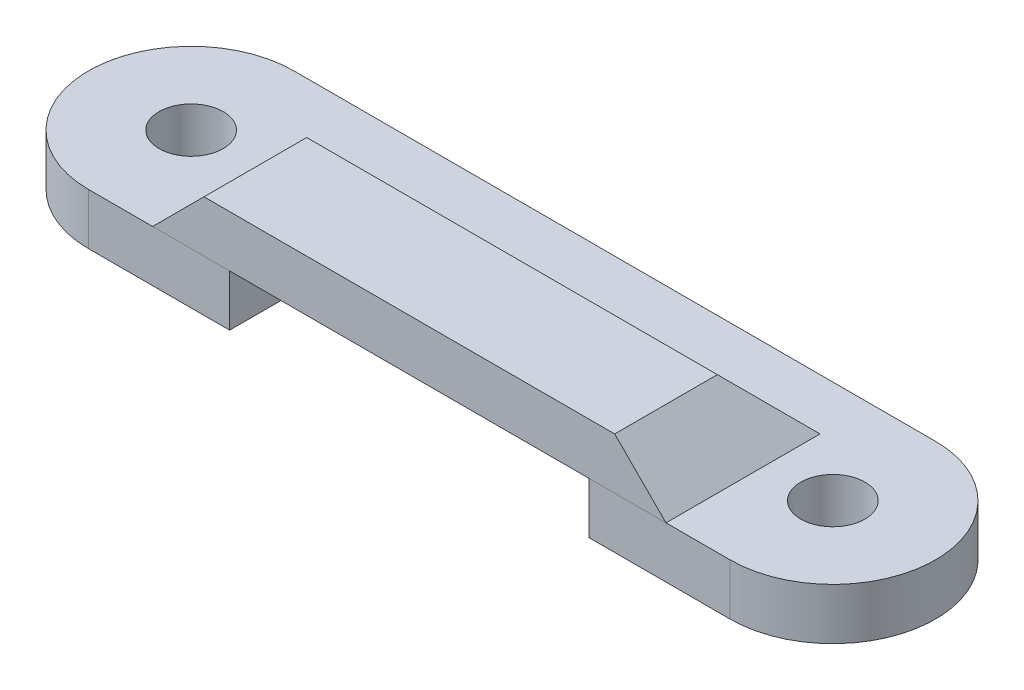
ISO-10303-21;
HEADER;
FILE_DESCRIPTION(('STEP AP214'),'2;1');
FILE_NAME('part.step','',(''),(''),'','','');
FILE_SCHEMA(('AUTOMOTIVE_DESIGN { 1 0 10303 214 1 1 1 1 }'));
ENDSEC;
DATA;
#1=APPLICATION_CONTEXT('core data for automotive mechanical design processes');
#2=APPLICATION_PROTOCOL_DEFINITION('international standard','automotive_design',2000,#1);
#3=PRODUCT_CONTEXT('',#1,'mechanical');
#4=PRODUCT('Part','Part','',(#3));
#5=PRODUCT_RELATED_PRODUCT_CATEGORY('part','',(#4));
#6=PRODUCT_DEFINITION_FORMATION('','',#4);
#7=PRODUCT_DEFINITION_CONTEXT('part definition',#1,'design');
#8=PRODUCT_DEFINITION('design','',#6,#7);
#9=PRODUCT_DEFINITION_SHAPE('','',#8);
#10=(LENGTH_UNIT() NAMED_UNIT(*) SI_UNIT(.MILLI.,.METRE.));
#11=(NAMED_UNIT(*) PLANE_ANGLE_UNIT() SI_UNIT($,.RADIAN.));
#12=(NAMED_UNIT(*) SI_UNIT($,.STERADIAN.) SOLID_ANGLE_UNIT());
#13=UNCERTAINTY_MEASURE_WITH_UNIT(LENGTH_MEASURE(1.E-05),#10,'distance_accuracy_value','');
#14=(GEOMETRIC_REPRESENTATION_CONTEXT(3) GLOBAL_UNCERTAINTY_ASSIGNED_CONTEXT((#13)) GLOBAL_UNIT_ASSIGNED_CONTEXT((#10,
#11,#12)) REPRESENTATION_CONTEXT('',''));
#15=CARTESIAN_POINT('',(0.,0.,0.));
#16=DIRECTION('',(0.,0.,1.));
#17=DIRECTION('',(1.,0.,0.));
#18=AXIS2_PLACEMENT_3D('',#15,#16,#17);
#19=CARTESIAN_POINT('',(20.,4.,-5.29744533560441));
#20=DIRECTION('',(0.,-1.,0.));
#21=DIRECTION('',(0.,0.,-1.));
#22=AXIS2_PLACEMENT_3D('',#19,#20,#21);
#23=PLANE('',#22);
#24=DIRECTION('',(0.,0.,1.));
#25=VECTOR('',#24,1.);
#26=CARTESIAN_POINT('',(20.,4.,-5.29744533560441));
#27=LINE('',#26,#25);
#28=CARTESIAN_POINT('',(20.,4.,-5.29744533560441));
#29=VERTEX_POINT('',#28);
#30=CARTESIAN_POINT('',(20.,4.,6.70255466439559));
#31=VERTEX_POINT('',#30);
#32=EDGE_CURVE('E105',#29,#31,#27,.T.);
#33=ORIENTED_EDGE('',*,*,#32,.T.);
#34=DIRECTION('',(1.,0.,0.));
#35=VECTOR('',#34,1.);
#36=CARTESIAN_POINT('',(20.,4.,6.70255466439559));
#37=LINE('',#36,#35);
#38=CARTESIAN_POINT('',(-20.,4.,6.70255466439559));
#39=VERTEX_POINT('',#38);
#40=EDGE_CURVE('E48',#39,#31,#37,.T.);
#41=ORIENTED_EDGE('',*,*,#40,.F.);
#42=DIRECTION('',(0.,0.,1.));
#43=VECTOR('',#42,1.);
#44=CARTESIAN_POINT('',(-20.,4.,-5.29744533560441));
#45=LINE('',#44,#43);
#46=CARTESIAN_POINT('',(-20.,4.,-5.29744533560441));
#47=VERTEX_POINT('',#46);
#48=EDGE_CURVE('E12',#47,#39,#45,.T.);
#49=ORIENTED_EDGE('',*,*,#48,.F.);
#50=DIRECTION('',(1.,0.,0.));
#51=VECTOR('',#50,1.);
#52=CARTESIAN_POINT('',(20.,4.,-5.29744533560441));
#53=LINE('',#52,#51);
#54=EDGE_CURVE('E102',#47,#29,#53,.T.);
#55=ORIENTED_EDGE('',*,*,#54,.T.);
#56=EDGE_LOOP('',(#33,#41,#49,#55));
#57=FACE_BOUND('',#56,.T.);
#58=ADVANCED_FACE('F45',(#57),#23,.T.);
#59=CARTESIAN_POINT('',(-20.,4.,-5.29744533560441));
#60=DIRECTION('',(-0.707106781186543,0.707106781186552,0.));
#61=DIRECTION('',(-0.707106781186552,-0.707106781186543,0.));
#62=AXIS2_PLACEMENT_3D('',#59,#60,#61);
#63=PLANE('',#62);
#64=DIRECTION('',(0.57735026918963,0.577350269189623,0.577350269189624));
#65=VECTOR('',#64,1.);
#66=CARTESIAN_POINT('',(-20.,4.,-5.29744533560441));
#67=LINE('',#66,#65);
#68=CARTESIAN_POINT('',(-16.,8.,-1.29744533560441));
#69=VERTEX_POINT('',#68);
#70=EDGE_CURVE('E113',#47,#69,#67,.T.);
#71=ORIENTED_EDGE('',*,*,#70,.F.);
#72=ORIENTED_EDGE('',*,*,#48,.T.);
#73=DIRECTION('',(-0.707106781186552,-0.707106781186543,0.));
#74=VECTOR('',#73,1.);
#75=CARTESIAN_POINT('',(-20.,4.,6.70255466439559));
#76=LINE('',#75,#74);
#77=CARTESIAN_POINT('',(-16.,8.,6.70255466439559));
#78=VERTEX_POINT('',#77);
#79=EDGE_CURVE('E95',#78,#39,#76,.T.);
#80=ORIENTED_EDGE('',*,*,#79,.F.);
#81=DIRECTION('',(0.,0.,1.));
#82=VECTOR('',#81,1.);
#83=CARTESIAN_POINT('',(-16.,8.,-5.29744533560441));
#84=LINE('',#83,#82);
#85=EDGE_CURVE('E55',#69,#78,#84,.T.);
#86=ORIENTED_EDGE('',*,*,#85,.F.);
#87=EDGE_LOOP('',(#71,#72,#80,#86));
#88=FACE_BOUND('',#87,.T.);
#89=ADVANCED_FACE('F99',(#88),#63,.T.);
#90=CARTESIAN_POINT('',(-16.,8.,-5.29744533560441));
#91=DIRECTION('',(0.,1.,0.));
#92=DIRECTION('',(0.,0.,1.));
#93=AXIS2_PLACEMENT_3D('',#90,#91,#92);
#94=PLANE('',#93);
#95=DIRECTION('',(1.,0.,0.));
#96=VECTOR('',#95,1.);
#97=CARTESIAN_POINT('',(-33.,8.,-1.29744533560441));
#98=LINE('',#97,#96);
#99=CARTESIAN_POINT('',(16.,8.,-1.29744533560441));
#100=VERTEX_POINT('',#99);
#101=EDGE_CURVE('E86',#69,#100,#98,.T.);
#102=ORIENTED_EDGE('',*,*,#101,.F.);
#103=ORIENTED_EDGE('',*,*,#85,.T.);
#104=DIRECTION('',(-1.,0.,0.));
#105=VECTOR('',#104,1.);
#106=CARTESIAN_POINT('',(-16.,8.,6.70255466439559));
#107=LINE('',#106,#105);
#108=CARTESIAN_POINT('',(16.,8.,6.70255466439559));
#109=VERTEX_POINT('',#108);
#110=EDGE_CURVE('E83',#109,#78,#107,.T.);
#111=ORIENTED_EDGE('',*,*,#110,.F.);
#112=DIRECTION('',(0.,0.,1.));
#113=VECTOR('',#112,1.);
#114=CARTESIAN_POINT('',(16.,8.,-5.29744533560441));
#115=LINE('',#114,#113);
#116=EDGE_CURVE('E90',#100,#109,#115,.T.);
#117=ORIENTED_EDGE('',*,*,#116,.F.);
#118=EDGE_LOOP('',(#102,#103,#111,#117));
#119=FACE_BOUND('',#118,.T.);
#120=ADVANCED_FACE('F81',(#119),#94,.T.);
#121=CARTESIAN_POINT('',(16.,8.,-5.29744533560441));
#122=DIRECTION('',(0.707106781186544,0.707106781186551,0.));
#123=DIRECTION('',(-0.707106781186551,0.707106781186544,0.));
#124=AXIS2_PLACEMENT_3D('',#121,#122,#123);
#125=PLANE('',#124);
#126=DIRECTION('',(0.57735026918963,-0.577350269189623,-0.577350269189624));
#127=VECTOR('',#126,1.);
#128=CARTESIAN_POINT('',(17.3333333333333,6.66666666666667,-2.63077866893774));
#129=LINE('',#128,#127);
#130=EDGE_CURVE('E63',#100,#29,#129,.T.);
#131=ORIENTED_EDGE('',*,*,#130,.F.);
#132=ORIENTED_EDGE('',*,*,#116,.T.);
#133=DIRECTION('',(-0.707106781186552,0.707106781186544,0.));
#134=VECTOR('',#133,1.);
#135=CARTESIAN_POINT('',(16.,8.,6.70255466439559));
#136=LINE('',#135,#134);
#137=EDGE_CURVE('E97',#31,#109,#136,.T.);
#138=ORIENTED_EDGE('',*,*,#137,.F.);
#139=ORIENTED_EDGE('',*,*,#32,.F.);
#140=EDGE_LOOP('',(#131,#132,#138,#139));
#141=FACE_BOUND('',#140,.T.);
#142=ADVANCED_FACE('F112',(#141),#125,.T.);
#143=CARTESIAN_POINT('',(0.,0.,6.70255466439559));
#144=DIRECTION('',(0.,0.,-1.));
#145=DIRECTION('',(-1.,0.,0.));
#146=AXIS2_PLACEMENT_3D('',#143,#144,#145);
#147=PLANE('',#146);
#148=ORIENTED_EDGE('',*,*,#40,.T.);
#149=ORIENTED_EDGE('',*,*,#137,.T.);
#150=ORIENTED_EDGE('',*,*,#110,.T.);
#151=ORIENTED_EDGE('',*,*,#79,.T.);
#152=EDGE_LOOP('',(#148,#149,#150,#151));
#153=FACE_BOUND('',#152,.T.);
#154=ADVANCED_FACE('F94',(#153),#147,.F.);
#155=CARTESIAN_POINT('',(-33.,8.,-1.29744533560441));
#156=DIRECTION('',(0.,-0.707106781186548,0.707106781186547));
#157=DIRECTION('',(0.,-0.707106781186547,-0.707106781186548));
#158=AXIS2_PLACEMENT_3D('',#155,#156,#157);
#159=PLANE('',#158);
#160=ORIENTED_EDGE('',*,*,#70,.T.);
#161=ORIENTED_EDGE('',*,*,#101,.T.);
#162=ORIENTED_EDGE('',*,*,#130,.T.);
#163=ORIENTED_EDGE('',*,*,#54,.F.);
#164=EDGE_LOOP('',(#160,#161,#162,#163));
#165=FACE_BOUND('',#164,.T.);
#166=ADVANCED_FACE('F120',(#165),#159,.F.);
#167=CLOSED_SHELL('',(#58,#89,#120,#142,#154,#166));
#168=MANIFOLD_SOLID_BREP('B2',#167);
#169=CARTESIAN_POINT('',(-25.,4.,6.70255466439559));
#170=DIRECTION('',(0.,0.,-1.));
#171=DIRECTION('',(-1.,0.,0.));
#172=AXIS2_PLACEMENT_3D('',#169,#170,#171);
#173=PLANE('',#172);
#174=DIRECTION('',(1.,0.,0.));
#175=VECTOR('',#174,1.);
#176=CARTESIAN_POINT('',(-25.,0.,6.70255466439559));
#177=LINE('',#176,#175);
#178=CARTESIAN_POINT('',(-25.,0.,6.70255466439559));
#179=VERTEX_POINT('',#178);
#180=CARTESIAN_POINT('',(-14.,0.,6.70255466439559));
#181=VERTEX_POINT('',#180);
#182=EDGE_CURVE('E305',#179,#181,#177,.T.);
#183=ORIENTED_EDGE('',*,*,#182,.T.);
#184=DIRECTION('',(0.,-1.,0.));
#185=VECTOR('',#184,1.);
#186=CARTESIAN_POINT('',(-14.,0.,6.70255466439559));
#187=LINE('',#186,#185);
#188=CARTESIAN_POINT('',(-14.,4.,6.70255466439559));
#189=VERTEX_POINT('',#188);
#190=EDGE_CURVE('E250',#189,#181,#187,.T.);
#191=ORIENTED_EDGE('',*,*,#190,.F.);
#192=DIRECTION('',(1.,0.,0.));
#193=VECTOR('',#192,1.);
#194=CARTESIAN_POINT('',(-25.,4.,6.70255466439559));
#195=LINE('',#194,#193);
#196=CARTESIAN_POINT('',(-25.,4.,6.70255466439559));
#197=VERTEX_POINT('',#196);
#198=EDGE_CURVE('E223',#197,#189,#195,.T.);
#199=ORIENTED_EDGE('',*,*,#198,.F.);
#200=DIRECTION('',(0.,-1.,0.));
#201=VECTOR('',#200,1.);
#202=CARTESIAN_POINT('',(-25.,4.,6.70255466439559));
#203=LINE('',#202,#201);
#204=EDGE_CURVE('E43',#197,#179,#203,.T.);
#205=ORIENTED_EDGE('',*,*,#204,.T.);
#206=EDGE_LOOP('',(#183,#191,#199,#205));
#207=FACE_BOUND('',#206,.T.);
#208=ADVANCED_FACE('F171',(#207),#173,.F.);
#209=CARTESIAN_POINT('',(-25.,4.,-1.29744533560441));
#210=DIRECTION('',(0.,-1.,0.));
#211=DIRECTION('',(0.,0.,-1.));
#212=AXIS2_PLACEMENT_3D('',#209,#210,#211);
#213=PLANE('',#212);
#214=ORIENTED_EDGE('',*,*,#198,.T.);
#215=DIRECTION('',(0.,0.,1.));
#216=VECTOR('',#215,1.);
#217=CARTESIAN_POINT('',(-14.,4.,-1.29744533560441));
#218=LINE('',#217,#216);
#219=CARTESIAN_POINT('',(-14.,4.,-1.29744533560441));
#220=VERTEX_POINT('',#219);
#221=EDGE_CURVE('E275',#220,#189,#218,.T.);
#222=ORIENTED_EDGE('',*,*,#221,.F.);
#223=DIRECTION('',(-1.,0.,0.));
#224=VECTOR('',#223,1.);
#225=CARTESIAN_POINT('',(-14.,4.,-1.29744533560441));
#226=LINE('',#225,#224);
#227=CARTESIAN_POINT('',(14.,4.,-1.29744533560441));
#228=VERTEX_POINT('',#227);
#229=EDGE_CURVE('E254',#228,#220,#226,.T.);
#230=ORIENTED_EDGE('',*,*,#229,.F.);
#231=DIRECTION('',(0.,0.,1.));
#232=VECTOR('',#231,1.);
#233=CARTESIAN_POINT('',(14.,4.,-1.29744533560441));
#234=LINE('',#233,#232);
#235=CARTESIAN_POINT('',(14.,4.,6.70255466439559));
#236=VERTEX_POINT('',#235);
#237=EDGE_CURVE('E278',#228,#236,#234,.T.);
#238=ORIENTED_EDGE('',*,*,#237,.T.);
#239=CARTESIAN_POINT('',(25.,4.,6.70255466439559));
#240=VERTEX_POINT('',#239);
#241=EDGE_CURVE('E296',#236,#240,#195,.T.);
#242=ORIENTED_EDGE('',*,*,#241,.T.);
#243=CARTESIAN_POINT('',(25.,4.,-1.29744533560441));
#244=DIRECTION('',(0.,1.,0.));
#245=DIRECTION('',(0.,0.,-1.));
#246=AXIS2_PLACEMENT_3D('',#243,#244,#245);
#247=CIRCLE('',#246,8.);
#248=CARTESIAN_POINT('',(25.,4.,-9.29744533560442));
#249=VERTEX_POINT('',#248);
#250=EDGE_CURVE('E298',#240,#249,#247,.T.);
#251=ORIENTED_EDGE('',*,*,#250,.T.);
#252=DIRECTION('',(-1.,0.,0.));
#253=VECTOR('',#252,1.);
#254=CARTESIAN_POINT('',(-25.,4.,-9.29744533560441));
#255=LINE('',#254,#253);
#256=CARTESIAN_POINT('',(-25.,4.,-9.29744533560441));
#257=VERTEX_POINT('',#256);
#258=EDGE_CURVE('E195',#249,#257,#255,.T.);
#259=ORIENTED_EDGE('',*,*,#258,.T.);
#260=CARTESIAN_POINT('',(-25.,4.,-1.29744533560441));
#261=DIRECTION('',(0.,1.,0.));
#262=DIRECTION('',(0.,0.,-1.));
#263=AXIS2_PLACEMENT_3D('',#260,#261,#262);
#264=CIRCLE('',#263,8.);
#265=EDGE_CURVE('E294',#257,#197,#264,.T.);
#266=ORIENTED_EDGE('',*,*,#265,.T.);
#267=EDGE_LOOP('',(#214,#222,#230,#238,#242,#251,#259,#266));
#268=FACE_BOUND('',#267,.T.);
#269=CARTESIAN_POINT('',(-25.,4.,-1.29744533560441));
#270=DIRECTION('',(0.,1.,0.));
#271=DIRECTION('',(0.,0.,1.));
#272=AXIS2_PLACEMENT_3D('',#269,#270,#271);
#273=CIRCLE('',#272,2.5);
#274=CARTESIAN_POINT('',(-25.,4.,1.20255466439559));
#275=VERTEX_POINT('',#274);
#276=EDGE_CURVE('E288',#275,#275,#273,.T.);
#277=ORIENTED_EDGE('',*,*,#276,.F.);
#278=EDGE_LOOP('',(#277));
#279=FACE_BOUND('',#278,.T.);
#280=CARTESIAN_POINT('',(25.,4.,-1.29744533560441));
#281=DIRECTION('',(0.,1.,0.));
#282=DIRECTION('',(0.,0.,1.));
#283=AXIS2_PLACEMENT_3D('',#280,#281,#282);
#284=CIRCLE('',#283,2.5);
#285=CARTESIAN_POINT('',(25.,4.,1.20255466439559));
#286=VERTEX_POINT('',#285);
#287=EDGE_CURVE('E282',#286,#286,#284,.T.);
#288=ORIENTED_EDGE('',*,*,#287,.F.);
#289=EDGE_LOOP('',(#288));
#290=FACE_BOUND('',#289,.T.);
#291=ADVANCED_FACE('F340',(#268,#279,#290),#213,.F.);
#292=CARTESIAN_POINT('',(-25.,0.,-1.29744533560441));
#293=DIRECTION('',(0.,-1.,0.));
#294=DIRECTION('',(0.,0.,-1.));
#295=AXIS2_PLACEMENT_3D('',#292,#293,#294);
#296=PLANE('',#295);
#297=DIRECTION('',(0.,0.,1.));
#298=VECTOR('',#297,1.);
#299=CARTESIAN_POINT('',(-14.,0.,-1.29744533560441));
#300=LINE('',#299,#298);
#301=CARTESIAN_POINT('',(-14.,0.,-1.29744533560441));
#302=VERTEX_POINT('',#301);
#303=EDGE_CURVE('E245',#302,#181,#300,.T.);
#304=ORIENTED_EDGE('',*,*,#303,.T.);
#305=ORIENTED_EDGE('',*,*,#182,.F.);
#306=CARTESIAN_POINT('',(-25.,0.,-1.29744533560441));
#307=DIRECTION('',(0.,1.,0.));
#308=DIRECTION('',(0.,0.,-1.));
#309=AXIS2_PLACEMENT_3D('',#306,#307,#308);
#310=CIRCLE('',#309,8.);
#311=CARTESIAN_POINT('',(-25.,0.,-9.29744533560441));
#312=VERTEX_POINT('',#311);
#313=EDGE_CURVE('E291',#312,#179,#310,.T.);
#314=ORIENTED_EDGE('',*,*,#313,.F.);
#315=DIRECTION('',(-1.,0.,0.));
#316=VECTOR('',#315,1.);
#317=CARTESIAN_POINT('',(-25.,0.,-9.29744533560441));
#318=LINE('',#317,#316);
#319=CARTESIAN_POINT('',(25.,0.,-9.29744533560442));
#320=VERTEX_POINT('',#319);
#321=EDGE_CURVE('E216',#320,#312,#318,.T.);
#322=ORIENTED_EDGE('',*,*,#321,.F.);
#323=CARTESIAN_POINT('',(25.,0.,-1.29744533560441));
#324=DIRECTION('',(0.,1.,0.));
#325=DIRECTION('',(0.,0.,-1.));
#326=AXIS2_PLACEMENT_3D('',#323,#324,#325);
#327=CIRCLE('',#326,8.);
#328=CARTESIAN_POINT('',(25.,0.,6.70255466439559));
#329=VERTEX_POINT('',#328);
#330=EDGE_CURVE('E307',#329,#320,#327,.T.);
#331=ORIENTED_EDGE('',*,*,#330,.F.);
#332=CARTESIAN_POINT('',(14.,0.,6.70255466439559));
#333=VERTEX_POINT('',#332);
#334=EDGE_CURVE('E304',#333,#329,#177,.T.);
#335=ORIENTED_EDGE('',*,*,#334,.F.);
#336=DIRECTION('',(0.,0.,1.));
#337=VECTOR('',#336,1.);
#338=CARTESIAN_POINT('',(14.,0.,-1.29744533560441));
#339=LINE('',#338,#337);
#340=CARTESIAN_POINT('',(14.,0.,-1.29744533560441));
#341=VERTEX_POINT('',#340);
#342=EDGE_CURVE('E186',#341,#333,#339,.T.);
#343=ORIENTED_EDGE('',*,*,#342,.F.);
#344=DIRECTION('',(1.,0.,0.));
#345=VECTOR('',#344,1.);
#346=CARTESIAN_POINT('',(-14.,0.,-1.29744533560441));
#347=LINE('',#346,#345);
#348=EDGE_CURVE('E260',#302,#341,#347,.T.);
#349=ORIENTED_EDGE('',*,*,#348,.F.);
#350=EDGE_LOOP('',(#304,#305,#314,#322,#331,#335,#343,#349));
#351=FACE_BOUND('',#350,.T.);
#352=CARTESIAN_POINT('',(-25.,0.,-1.29744533560441));
#353=DIRECTION('',(0.,1.,0.));
#354=DIRECTION('',(0.,0.,1.));
#355=AXIS2_PLACEMENT_3D('',#352,#353,#354);
#356=CIRCLE('',#355,2.5);
#357=CARTESIAN_POINT('',(-25.,0.,1.20255466439559));
#358=VERTEX_POINT('',#357);
#359=EDGE_CURVE('E285',#358,#358,#356,.T.);
#360=ORIENTED_EDGE('',*,*,#359,.T.);
#361=EDGE_LOOP('',(#360));
#362=FACE_BOUND('',#361,.T.);
#363=CARTESIAN_POINT('',(25.,0.,-1.29744533560441));
#364=DIRECTION('',(0.,1.,0.));
#365=DIRECTION('',(0.,0.,1.));
#366=AXIS2_PLACEMENT_3D('',#363,#364,#365);
#367=CIRCLE('',#366,2.5);
#368=CARTESIAN_POINT('',(25.,0.,1.20255466439559));
#369=VERTEX_POINT('',#368);
#370=EDGE_CURVE('E277',#369,#369,#367,.T.);
#371=ORIENTED_EDGE('',*,*,#370,.T.);
#372=EDGE_LOOP('',(#371));
#373=FACE_BOUND('',#372,.T.);
#374=ADVANCED_FACE('F265',(#351,#362,#373),#296,.T.);
#375=CARTESIAN_POINT('',(-25.,4.,-1.29744533560441));
#376=DIRECTION('',(0.,-1.,0.));
#377=DIRECTION('',(0.,0.,-1.));
#378=AXIS2_PLACEMENT_3D('',#375,#376,#377);
#379=CYLINDRICAL_SURFACE('',#378,8.);
#380=ORIENTED_EDGE('',*,*,#313,.T.);
#381=ORIENTED_EDGE('',*,*,#204,.F.);
#382=ORIENTED_EDGE('',*,*,#265,.F.);
#383=DIRECTION('',(0.,-1.,0.));
#384=VECTOR('',#383,1.);
#385=CARTESIAN_POINT('',(-25.,4.,-9.29744533560441));
#386=LINE('',#385,#384);
#387=EDGE_CURVE('E301',#257,#312,#386,.T.);
#388=ORIENTED_EDGE('',*,*,#387,.T.);
#389=EDGE_LOOP('',(#380,#381,#382,#388));
#390=FACE_BOUND('',#389,.T.);
#391=ADVANCED_FACE('F173',(#390),#379,.T.);
#392=ORIENTED_EDGE('',*,*,#241,.F.);
#393=DIRECTION('',(0.,1.,0.));
#394=VECTOR('',#393,1.);
#395=CARTESIAN_POINT('',(14.,0.,6.70255466439559));
#396=LINE('',#395,#394);
#397=EDGE_CURVE('E263',#333,#236,#396,.T.);
#398=ORIENTED_EDGE('',*,*,#397,.F.);
#399=ORIENTED_EDGE('',*,*,#334,.T.);
#400=DIRECTION('',(0.,-1.,0.));
#401=VECTOR('',#400,1.);
#402=CARTESIAN_POINT('',(25.,4.,6.70255466439559));
#403=LINE('',#402,#401);
#404=EDGE_CURVE('E179',#240,#329,#403,.T.);
#405=ORIENTED_EDGE('',*,*,#404,.F.);
#406=EDGE_LOOP('',(#392,#398,#399,#405));
#407=FACE_BOUND('',#406,.T.);
#408=ADVANCED_FACE('F336',(#407),#173,.F.);
#409=CARTESIAN_POINT('',(25.,4.,-1.29744533560441));
#410=DIRECTION('',(0.,-1.,0.));
#411=DIRECTION('',(0.,0.,-1.));
#412=AXIS2_PLACEMENT_3D('',#409,#410,#411);
#413=CYLINDRICAL_SURFACE('',#412,8.);
#414=ORIENTED_EDGE('',*,*,#330,.T.);
#415=DIRECTION('',(0.,-1.,0.));
#416=VECTOR('',#415,1.);
#417=CARTESIAN_POINT('',(25.,4.,-9.29744533560442));
#418=LINE('',#417,#416);
#419=EDGE_CURVE('E311',#249,#320,#418,.T.);
#420=ORIENTED_EDGE('',*,*,#419,.F.);
#421=ORIENTED_EDGE('',*,*,#250,.F.);
#422=ORIENTED_EDGE('',*,*,#404,.T.);
#423=EDGE_LOOP('',(#414,#420,#421,#422));
#424=FACE_BOUND('',#423,.T.);
#425=ADVANCED_FACE('F317',(#424),#413,.T.);
#426=CARTESIAN_POINT('',(-25.,4.,-9.29744533560441));
#427=DIRECTION('',(0.,0.,1.));
#428=DIRECTION('',(1.,0.,0.));
#429=AXIS2_PLACEMENT_3D('',#426,#427,#428);
#430=PLANE('',#429);
#431=ORIENTED_EDGE('',*,*,#321,.T.);
#432=ORIENTED_EDGE('',*,*,#387,.F.);
#433=ORIENTED_EDGE('',*,*,#258,.F.);
#434=ORIENTED_EDGE('',*,*,#419,.T.);
#435=EDGE_LOOP('',(#431,#432,#433,#434));
#436=FACE_BOUND('',#435,.T.);
#437=ADVANCED_FACE('F325',(#436),#430,.F.);
#438=CARTESIAN_POINT('',(-25.,4.,-1.29744533560441));
#439=DIRECTION('',(0.,-1.,0.));
#440=DIRECTION('',(0.,0.,-1.));
#441=AXIS2_PLACEMENT_3D('',#438,#439,#440);
#442=CYLINDRICAL_SURFACE('',#441,2.5);
#443=ORIENTED_EDGE('',*,*,#276,.T.);
#444=EDGE_LOOP('',(#443));
#445=FACE_BOUND('',#444,.T.);
#446=ORIENTED_EDGE('',*,*,#359,.F.);
#447=EDGE_LOOP('',(#446));
#448=FACE_BOUND('',#447,.T.);
#449=ADVANCED_FACE('F327',(#445,#448),#442,.F.);
#450=CARTESIAN_POINT('',(25.,4.,-1.29744533560441));
#451=DIRECTION('',(0.,-1.,0.));
#452=DIRECTION('',(0.,0.,-1.));
#453=AXIS2_PLACEMENT_3D('',#450,#451,#452);
#454=CYLINDRICAL_SURFACE('',#453,2.5);
#455=ORIENTED_EDGE('',*,*,#287,.T.);
#456=EDGE_LOOP('',(#455));
#457=FACE_BOUND('',#456,.T.);
#458=ORIENTED_EDGE('',*,*,#370,.F.);
#459=EDGE_LOOP('',(#458));
#460=FACE_BOUND('',#459,.T.);
#461=ADVANCED_FACE('F333',(#457,#460),#454,.F.);
#462=CARTESIAN_POINT('',(-14.,0.,-1.29744533560441));
#463=DIRECTION('',(-1.,0.,0.));
#464=DIRECTION('',(0.,0.,1.));
#465=AXIS2_PLACEMENT_3D('',#462,#463,#464);
#466=PLANE('',#465);
#467=ORIENTED_EDGE('',*,*,#190,.T.);
#468=ORIENTED_EDGE('',*,*,#303,.F.);
#469=DIRECTION('',(0.,-1.,0.));
#470=VECTOR('',#469,1.);
#471=CARTESIAN_POINT('',(-14.,0.,-1.29744533560441));
#472=LINE('',#471,#470);
#473=EDGE_CURVE('E248',#220,#302,#472,.T.);
#474=ORIENTED_EDGE('',*,*,#473,.F.);
#475=ORIENTED_EDGE('',*,*,#221,.T.);
#476=EDGE_LOOP('',(#467,#468,#474,#475));
#477=FACE_BOUND('',#476,.T.);
#478=ADVANCED_FACE('F247',(#477),#466,.F.);
#479=CARTESIAN_POINT('',(14.,0.,-1.29744533560441));
#480=DIRECTION('',(1.,0.,0.));
#481=DIRECTION('',(0.,1.,0.));
#482=AXIS2_PLACEMENT_3D('',#479,#480,#481);
#483=PLANE('',#482);
#484=ORIENTED_EDGE('',*,*,#397,.T.);
#485=ORIENTED_EDGE('',*,*,#237,.F.);
#486=DIRECTION('',(0.,1.,0.));
#487=VECTOR('',#486,1.);
#488=CARTESIAN_POINT('',(14.,0.,-1.29744533560441));
#489=LINE('',#488,#487);
#490=EDGE_CURVE('E268',#341,#228,#489,.T.);
#491=ORIENTED_EDGE('',*,*,#490,.F.);
#492=ORIENTED_EDGE('',*,*,#342,.T.);
#493=EDGE_LOOP('',(#484,#485,#491,#492));
#494=FACE_BOUND('',#493,.T.);
#495=ADVANCED_FACE('F350',(#494),#483,.F.);
#496=CARTESIAN_POINT('',(0.,0.,-1.29744533560441));
#497=DIRECTION('',(0.,0.,-1.));
#498=DIRECTION('',(-1.,0.,0.));
#499=AXIS2_PLACEMENT_3D('',#496,#497,#498);
#500=PLANE('',#499);
#501=ORIENTED_EDGE('',*,*,#473,.T.);
#502=ORIENTED_EDGE('',*,*,#348,.T.);
#503=ORIENTED_EDGE('',*,*,#490,.T.);
#504=ORIENTED_EDGE('',*,*,#229,.T.);
#505=EDGE_LOOP('',(#501,#502,#503,#504));
#506=FACE_BOUND('',#505,.T.);
#507=ADVANCED_FACE('F258',(#506),#500,.F.);
#508=CLOSED_SHELL('',(#208,#291,#374,#391,#408,#425,#437,#449,#461,#478,#495,#507));
#509=MANIFOLD_SOLID_BREP('B6',#508);
#510=ADVANCED_BREP_SHAPE_REPRESENTATION('',(#18,#168,#509),#14);
#511=SHAPE_DEFINITION_REPRESENTATION(#9,#510);
ENDSEC;
END-ISO-10303-21;
